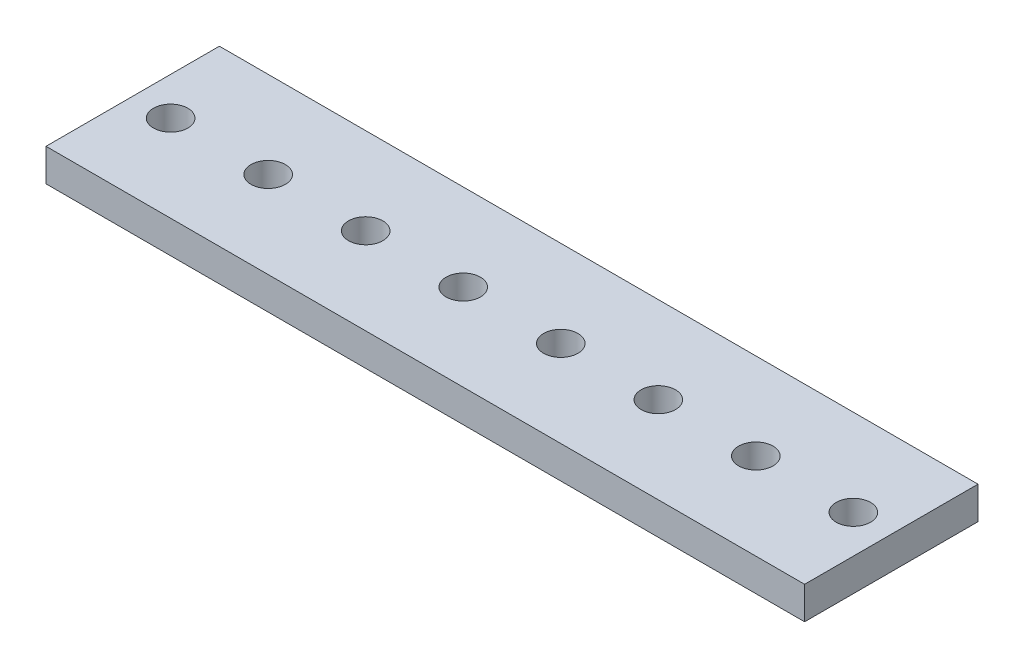
ISO-10303-21;
HEADER;
FILE_DESCRIPTION(('STEP AP214'),'2;1');
FILE_NAME('part.step','',(''),(''),'','','');
FILE_SCHEMA(('AUTOMOTIVE_DESIGN { 1 0 10303 214 1 1 1 1 }'));
ENDSEC;
DATA;
#1=APPLICATION_CONTEXT('core data for automotive mechanical design processes');
#2=APPLICATION_PROTOCOL_DEFINITION('international standard','automotive_design',2000,#1);
#3=PRODUCT_CONTEXT('',#1,'mechanical');
#4=PRODUCT('Part','Part','',(#3));
#5=PRODUCT_RELATED_PRODUCT_CATEGORY('part','',(#4));
#6=PRODUCT_DEFINITION_FORMATION('','',#4);
#7=PRODUCT_DEFINITION_CONTEXT('part definition',#1,'design');
#8=PRODUCT_DEFINITION('design','',#6,#7);
#9=PRODUCT_DEFINITION_SHAPE('','',#8);
#10=(LENGTH_UNIT() NAMED_UNIT(*) SI_UNIT(.MILLI.,.METRE.));
#11=(NAMED_UNIT(*) PLANE_ANGLE_UNIT() SI_UNIT($,.RADIAN.));
#12=(NAMED_UNIT(*) SI_UNIT($,.STERADIAN.) SOLID_ANGLE_UNIT());
#13=UNCERTAINTY_MEASURE_WITH_UNIT(LENGTH_MEASURE(1.E-05),#10,'distance_accuracy_value','');
#14=(GEOMETRIC_REPRESENTATION_CONTEXT(3) GLOBAL_UNCERTAINTY_ASSIGNED_CONTEXT((#13)) GLOBAL_UNIT_ASSIGNED_CONTEXT((#10,
#11,#12)) REPRESENTATION_CONTEXT('',''));
#15=CARTESIAN_POINT('',(0.,0.,0.));
#16=DIRECTION('',(0.,0.,1.));
#17=DIRECTION('',(1.,0.,0.));
#18=AXIS2_PLACEMENT_3D('',#15,#16,#17);
#19=CARTESIAN_POINT('',(-35.,3.,-7.99999999999999));
#20=DIRECTION('',(0.,-1.,0.));
#21=DIRECTION('',(0.,0.,-1.));
#22=AXIS2_PLACEMENT_3D('',#19,#20,#21);
#23=PLANE('',#22);
#24=CARTESIAN_POINT('',(-22.5,3.,1.25693328198353E-13));
#25=DIRECTION('',(0.,1.,0.));
#26=DIRECTION('',(0.,0.,1.));
#27=AXIS2_PLACEMENT_3D('',#24,#25,#26);
#28=CIRCLE('',#27,1.5875);
#29=CARTESIAN_POINT('',(-22.5,3.,1.58750000000012));
#30=VERTEX_POINT('',#29);
#31=EDGE_CURVE('E145',#30,#30,#28,.T.);
#32=ORIENTED_EDGE('',*,*,#31,.F.);
#33=EDGE_LOOP('',(#32));
#34=FACE_BOUND('',#33,.T.);
#35=CARTESIAN_POINT('',(31.5,3.,0.));
#36=DIRECTION('',(0.,1.,0.));
#37=DIRECTION('',(0.,0.,1.));
#38=AXIS2_PLACEMENT_3D('',#35,#36,#37);
#39=CIRCLE('',#38,1.5875);
#40=CARTESIAN_POINT('',(31.5,3.,1.5875));
#41=VERTEX_POINT('',#40);
#42=EDGE_CURVE('E133',#41,#41,#39,.T.);
#43=ORIENTED_EDGE('',*,*,#42,.F.);
#44=EDGE_LOOP('',(#43));
#45=FACE_BOUND('',#44,.T.);
#46=CARTESIAN_POINT('',(13.5,3.,0.));
#47=DIRECTION('',(0.,1.,0.));
#48=DIRECTION('',(0.,0.,1.));
#49=AXIS2_PLACEMENT_3D('',#46,#47,#48);
#50=CIRCLE('',#49,1.5875);
#51=CARTESIAN_POINT('',(13.5,3.,1.5875000000001));
#52=VERTEX_POINT('',#51);
#53=EDGE_CURVE('E121',#52,#52,#50,.T.);
#54=ORIENTED_EDGE('',*,*,#53,.F.);
#55=EDGE_LOOP('',(#54));
#56=FACE_BOUND('',#55,.T.);
#57=CARTESIAN_POINT('',(-4.5,3.,0.));
#58=DIRECTION('',(0.,1.,0.));
#59=DIRECTION('',(0.,0.,1.));
#60=AXIS2_PLACEMENT_3D('',#57,#58,#59);
#61=CIRCLE('',#60,1.5875);
#62=CARTESIAN_POINT('',(-4.5,3.,1.5875));
#63=VERTEX_POINT('',#62);
#64=EDGE_CURVE('E100',#63,#63,#61,.T.);
#65=ORIENTED_EDGE('',*,*,#64,.F.);
#66=EDGE_LOOP('',(#65));
#67=FACE_BOUND('',#66,.T.);
#68=DIRECTION('',(-1.,0.,0.));
#69=VECTOR('',#68,1.);
#70=CARTESIAN_POINT('',(35.,3.,-8.00000000000001));
#71=LINE('',#70,#69);
#72=CARTESIAN_POINT('',(35.,3.,-8.00000000000001));
#73=VERTEX_POINT('',#72);
#74=CARTESIAN_POINT('',(-35.,3.,-8.));
#75=VERTEX_POINT('',#74);
#76=EDGE_CURVE('E85',#73,#75,#71,.T.);
#77=ORIENTED_EDGE('',*,*,#76,.T.);
#78=DIRECTION('',(0.,0.,1.));
#79=VECTOR('',#78,1.);
#80=CARTESIAN_POINT('',(-35.,3.,8.00000000000001));
#81=LINE('',#80,#79);
#82=CARTESIAN_POINT('',(-35.,3.,8.00000000000001));
#83=VERTEX_POINT('',#82);
#84=EDGE_CURVE('E80',#75,#83,#81,.T.);
#85=ORIENTED_EDGE('',*,*,#84,.T.);
#86=DIRECTION('',(1.,0.,0.));
#87=VECTOR('',#86,1.);
#88=CARTESIAN_POINT('',(35.,3.,8.));
#89=LINE('',#88,#87);
#90=CARTESIAN_POINT('',(35.,3.,8.));
#91=VERTEX_POINT('',#90);
#92=EDGE_CURVE('E83',#83,#91,#89,.T.);
#93=ORIENTED_EDGE('',*,*,#92,.T.);
#94=DIRECTION('',(0.,0.,-1.));
#95=VECTOR('',#94,1.);
#96=CARTESIAN_POINT('',(35.,3.,8.));
#97=LINE('',#96,#95);
#98=EDGE_CURVE('E50',#91,#73,#97,.T.);
#99=ORIENTED_EDGE('',*,*,#98,.T.);
#100=EDGE_LOOP('',(#77,#85,#93,#99));
#101=FACE_BOUND('',#100,.T.);
#102=CARTESIAN_POINT('',(4.5,3.,0.));
#103=DIRECTION('',(0.,1.,0.));
#104=DIRECTION('',(0.,0.,1.));
#105=AXIS2_PLACEMENT_3D('',#102,#103,#104);
#106=CIRCLE('',#105,1.5875);
#107=CARTESIAN_POINT('',(4.5,3.,1.58750000000005));
#108=VERTEX_POINT('',#107);
#109=EDGE_CURVE('E115',#108,#108,#106,.T.);
#110=ORIENTED_EDGE('',*,*,#109,.F.);
#111=EDGE_LOOP('',(#110));
#112=FACE_BOUND('',#111,.T.);
#113=CARTESIAN_POINT('',(22.5,3.,1.43765208071578E-13));
#114=DIRECTION('',(0.,1.,0.));
#115=DIRECTION('',(0.,0.,1.));
#116=AXIS2_PLACEMENT_3D('',#113,#114,#115);
#117=CIRCLE('',#116,1.5875);
#118=CARTESIAN_POINT('',(22.5,3.,1.58750000000014));
#119=VERTEX_POINT('',#118);
#120=EDGE_CURVE('E127',#119,#119,#117,.T.);
#121=ORIENTED_EDGE('',*,*,#120,.F.);
#122=EDGE_LOOP('',(#121));
#123=FACE_BOUND('',#122,.T.);
#124=CARTESIAN_POINT('',(-13.5,3.,0.));
#125=DIRECTION('',(0.,1.,0.));
#126=DIRECTION('',(0.,0.,1.));
#127=AXIS2_PLACEMENT_3D('',#124,#125,#126);
#128=CIRCLE('',#127,1.5875);
#129=CARTESIAN_POINT('',(-13.5,3.,1.58750000000006));
#130=VERTEX_POINT('',#129);
#131=EDGE_CURVE('E139',#130,#130,#128,.T.);
#132=ORIENTED_EDGE('',*,*,#131,.F.);
#133=EDGE_LOOP('',(#132));
#134=FACE_BOUND('',#133,.T.);
#135=CARTESIAN_POINT('',(-31.5,3.,1.88539992297529E-13));
#136=DIRECTION('',(0.,1.,0.));
#137=DIRECTION('',(0.,0.,1.));
#138=AXIS2_PLACEMENT_3D('',#135,#136,#137);
#139=CIRCLE('',#138,1.5875);
#140=CARTESIAN_POINT('',(-31.5,3.,1.58750000000019));
#141=VERTEX_POINT('',#140);
#142=EDGE_CURVE('E151',#141,#141,#139,.T.);
#143=ORIENTED_EDGE('',*,*,#142,.F.);
#144=EDGE_LOOP('',(#143));
#145=FACE_BOUND('',#144,.T.);
#146=ADVANCED_FACE('F33',(#34,#45,#56,#67,#101,#112,#123,#134,#145),#23,.F.);
#147=CARTESIAN_POINT('',(-35.,0.,-7.99999999999999));
#148=DIRECTION('',(0.,-1.,0.));
#149=DIRECTION('',(0.,0.,-1.));
#150=AXIS2_PLACEMENT_3D('',#147,#148,#149);
#151=PLANE('',#150);
#152=CARTESIAN_POINT('',(-22.5,0.,1.25693328198353E-13));
#153=DIRECTION('',(0.,1.,0.));
#154=DIRECTION('',(0.,0.,1.));
#155=AXIS2_PLACEMENT_3D('',#152,#153,#154);
#156=CIRCLE('',#155,1.5875);
#157=CARTESIAN_POINT('',(-22.5,0.,1.58750000000012));
#158=VERTEX_POINT('',#157);
#159=EDGE_CURVE('E148',#158,#158,#156,.T.);
#160=ORIENTED_EDGE('',*,*,#159,.T.);
#161=EDGE_LOOP('',(#160));
#162=FACE_BOUND('',#161,.T.);
#163=CARTESIAN_POINT('',(31.5,0.,0.));
#164=DIRECTION('',(0.,1.,0.));
#165=DIRECTION('',(0.,0.,1.));
#166=AXIS2_PLACEMENT_3D('',#163,#164,#165);
#167=CIRCLE('',#166,1.5875);
#168=CARTESIAN_POINT('',(31.5,0.,1.5875));
#169=VERTEX_POINT('',#168);
#170=EDGE_CURVE('E136',#169,#169,#167,.T.);
#171=ORIENTED_EDGE('',*,*,#170,.T.);
#172=EDGE_LOOP('',(#171));
#173=FACE_BOUND('',#172,.T.);
#174=CARTESIAN_POINT('',(13.5,0.,0.));
#175=DIRECTION('',(0.,1.,0.));
#176=DIRECTION('',(0.,0.,1.));
#177=AXIS2_PLACEMENT_3D('',#174,#175,#176);
#178=CIRCLE('',#177,1.5875);
#179=CARTESIAN_POINT('',(13.5,0.,1.5875000000001));
#180=VERTEX_POINT('',#179);
#181=EDGE_CURVE('E124',#180,#180,#178,.T.);
#182=ORIENTED_EDGE('',*,*,#181,.T.);
#183=EDGE_LOOP('',(#182));
#184=FACE_BOUND('',#183,.T.);
#185=CARTESIAN_POINT('',(-4.5,0.,0.));
#186=DIRECTION('',(0.,1.,0.));
#187=DIRECTION('',(0.,0.,1.));
#188=AXIS2_PLACEMENT_3D('',#185,#186,#187);
#189=CIRCLE('',#188,1.5875);
#190=CARTESIAN_POINT('',(-4.5,0.,1.5875));
#191=VERTEX_POINT('',#190);
#192=EDGE_CURVE('E112',#191,#191,#189,.T.);
#193=ORIENTED_EDGE('',*,*,#192,.T.);
#194=EDGE_LOOP('',(#193));
#195=FACE_BOUND('',#194,.T.);
#196=DIRECTION('',(-1.,0.,0.));
#197=VECTOR('',#196,1.);
#198=CARTESIAN_POINT('',(35.,0.,-8.00000000000001));
#199=LINE('',#198,#197);
#200=CARTESIAN_POINT('',(35.,0.,-8.00000000000001));
#201=VERTEX_POINT('',#200);
#202=CARTESIAN_POINT('',(-35.,0.,-8.));
#203=VERTEX_POINT('',#202);
#204=EDGE_CURVE('E97',#201,#203,#199,.T.);
#205=ORIENTED_EDGE('',*,*,#204,.F.);
#206=DIRECTION('',(0.,0.,-1.));
#207=VECTOR('',#206,1.);
#208=CARTESIAN_POINT('',(35.,0.,8.));
#209=LINE('',#208,#207);
#210=CARTESIAN_POINT('',(35.,0.,8.));
#211=VERTEX_POINT('',#210);
#212=EDGE_CURVE('E73',#211,#201,#209,.T.);
#213=ORIENTED_EDGE('',*,*,#212,.F.);
#214=DIRECTION('',(1.,0.,0.));
#215=VECTOR('',#214,1.);
#216=CARTESIAN_POINT('',(35.,0.,8.));
#217=LINE('',#216,#215);
#218=CARTESIAN_POINT('',(-35.,0.,8.00000000000001));
#219=VERTEX_POINT('',#218);
#220=EDGE_CURVE('E67',#219,#211,#217,.T.);
#221=ORIENTED_EDGE('',*,*,#220,.F.);
#222=DIRECTION('',(0.,0.,1.));
#223=VECTOR('',#222,1.);
#224=CARTESIAN_POINT('',(-35.,0.,8.00000000000001));
#225=LINE('',#224,#223);
#226=EDGE_CURVE('E89',#203,#219,#225,.T.);
#227=ORIENTED_EDGE('',*,*,#226,.F.);
#228=EDGE_LOOP('',(#205,#213,#221,#227));
#229=FACE_BOUND('',#228,.T.);
#230=CARTESIAN_POINT('',(4.5,0.,0.));
#231=DIRECTION('',(0.,1.,0.));
#232=DIRECTION('',(0.,0.,1.));
#233=AXIS2_PLACEMENT_3D('',#230,#231,#232);
#234=CIRCLE('',#233,1.5875);
#235=CARTESIAN_POINT('',(4.5,0.,1.58750000000005));
#236=VERTEX_POINT('',#235);
#237=EDGE_CURVE('E118',#236,#236,#234,.T.);
#238=ORIENTED_EDGE('',*,*,#237,.T.);
#239=EDGE_LOOP('',(#238));
#240=FACE_BOUND('',#239,.T.);
#241=CARTESIAN_POINT('',(22.5,0.,1.43765208071578E-13));
#242=DIRECTION('',(0.,1.,0.));
#243=DIRECTION('',(0.,0.,1.));
#244=AXIS2_PLACEMENT_3D('',#241,#242,#243);
#245=CIRCLE('',#244,1.5875);
#246=CARTESIAN_POINT('',(22.5,0.,1.58750000000014));
#247=VERTEX_POINT('',#246);
#248=EDGE_CURVE('E130',#247,#247,#245,.T.);
#249=ORIENTED_EDGE('',*,*,#248,.T.);
#250=EDGE_LOOP('',(#249));
#251=FACE_BOUND('',#250,.T.);
#252=CARTESIAN_POINT('',(-13.5,0.,0.));
#253=DIRECTION('',(0.,1.,0.));
#254=DIRECTION('',(0.,0.,1.));
#255=AXIS2_PLACEMENT_3D('',#252,#253,#254);
#256=CIRCLE('',#255,1.5875);
#257=CARTESIAN_POINT('',(-13.5,0.,1.58750000000006));
#258=VERTEX_POINT('',#257);
#259=EDGE_CURVE('E142',#258,#258,#256,.T.);
#260=ORIENTED_EDGE('',*,*,#259,.T.);
#261=EDGE_LOOP('',(#260));
#262=FACE_BOUND('',#261,.T.);
#263=CARTESIAN_POINT('',(-31.5,0.,1.88539992297529E-13));
#264=DIRECTION('',(0.,1.,0.));
#265=DIRECTION('',(0.,0.,1.));
#266=AXIS2_PLACEMENT_3D('',#263,#264,#265);
#267=CIRCLE('',#266,1.5875);
#268=CARTESIAN_POINT('',(-31.5,0.,1.58750000000019));
#269=VERTEX_POINT('',#268);
#270=EDGE_CURVE('E154',#269,#269,#267,.T.);
#271=ORIENTED_EDGE('',*,*,#270,.T.);
#272=EDGE_LOOP('',(#271));
#273=FACE_BOUND('',#272,.T.);
#274=ADVANCED_FACE('F108',(#162,#173,#184,#195,#229,#240,#251,#262,#273),#151,.T.);
#275=CARTESIAN_POINT('',(35.,3.,-8.00000000000001));
#276=DIRECTION('',(0.,0.,1.));
#277=DIRECTION('',(1.,0.,0.));
#278=AXIS2_PLACEMENT_3D('',#275,#276,#277);
#279=PLANE('',#278);
#280=ORIENTED_EDGE('',*,*,#204,.T.);
#281=DIRECTION('',(0.,-1.,0.));
#282=VECTOR('',#281,1.);
#283=CARTESIAN_POINT('',(-35.,3.,-8.));
#284=LINE('',#283,#282);
#285=EDGE_CURVE('E11',#75,#203,#284,.T.);
#286=ORIENTED_EDGE('',*,*,#285,.F.);
#287=ORIENTED_EDGE('',*,*,#76,.F.);
#288=DIRECTION('',(0.,-1.,0.));
#289=VECTOR('',#288,1.);
#290=CARTESIAN_POINT('',(35.,3.,-8.00000000000001));
#291=LINE('',#290,#289);
#292=EDGE_CURVE('E93',#73,#201,#291,.T.);
#293=ORIENTED_EDGE('',*,*,#292,.T.);
#294=EDGE_LOOP('',(#280,#286,#287,#293));
#295=FACE_BOUND('',#294,.T.);
#296=ADVANCED_FACE('F35',(#295),#279,.F.);
#297=CARTESIAN_POINT('',(-35.,3.,8.00000000000001));
#298=DIRECTION('',(1.,0.,0.));
#299=DIRECTION('',(0.,0.,-1.));
#300=AXIS2_PLACEMENT_3D('',#297,#298,#299);
#301=PLANE('',#300);
#302=ORIENTED_EDGE('',*,*,#226,.T.);
#303=DIRECTION('',(0.,-1.,0.));
#304=VECTOR('',#303,1.);
#305=CARTESIAN_POINT('',(-35.,3.,8.00000000000001));
#306=LINE('',#305,#304);
#307=EDGE_CURVE('E42',#83,#219,#306,.T.);
#308=ORIENTED_EDGE('',*,*,#307,.F.);
#309=ORIENTED_EDGE('',*,*,#84,.F.);
#310=ORIENTED_EDGE('',*,*,#285,.T.);
#311=EDGE_LOOP('',(#302,#308,#309,#310));
#312=FACE_BOUND('',#311,.T.);
#313=ADVANCED_FACE('F88',(#312),#301,.F.);
#314=CARTESIAN_POINT('',(35.,3.,8.));
#315=DIRECTION('',(0.,0.,-1.));
#316=DIRECTION('',(-1.,0.,0.));
#317=AXIS2_PLACEMENT_3D('',#314,#315,#316);
#318=PLANE('',#317);
#319=ORIENTED_EDGE('',*,*,#220,.T.);
#320=DIRECTION('',(0.,-1.,0.));
#321=VECTOR('',#320,1.);
#322=CARTESIAN_POINT('',(35.,3.,8.));
#323=LINE('',#322,#321);
#324=EDGE_CURVE('E90',#91,#211,#323,.T.);
#325=ORIENTED_EDGE('',*,*,#324,.F.);
#326=ORIENTED_EDGE('',*,*,#92,.F.);
#327=ORIENTED_EDGE('',*,*,#307,.T.);
#328=EDGE_LOOP('',(#319,#325,#326,#327));
#329=FACE_BOUND('',#328,.T.);
#330=ADVANCED_FACE('F91',(#329),#318,.F.);
#331=CARTESIAN_POINT('',(35.,3.,8.));
#332=DIRECTION('',(-1.,0.,0.));
#333=DIRECTION('',(0.,0.,1.));
#334=AXIS2_PLACEMENT_3D('',#331,#332,#333);
#335=PLANE('',#334);
#336=ORIENTED_EDGE('',*,*,#212,.T.);
#337=ORIENTED_EDGE('',*,*,#292,.F.);
#338=ORIENTED_EDGE('',*,*,#98,.F.);
#339=ORIENTED_EDGE('',*,*,#324,.T.);
#340=EDGE_LOOP('',(#336,#337,#338,#339));
#341=FACE_BOUND('',#340,.T.);
#342=ADVANCED_FACE('F105',(#341),#335,.F.);
#343=CARTESIAN_POINT('',(-4.5,3.,0.));
#344=DIRECTION('',(0.,-1.,0.));
#345=DIRECTION('',(0.,0.,-1.));
#346=AXIS2_PLACEMENT_3D('',#343,#344,#345);
#347=CYLINDRICAL_SURFACE('',#346,1.5875);
#348=ORIENTED_EDGE('',*,*,#64,.T.);
#349=EDGE_LOOP('',(#348));
#350=FACE_BOUND('',#349,.T.);
#351=ORIENTED_EDGE('',*,*,#192,.F.);
#352=EDGE_LOOP('',(#351));
#353=FACE_BOUND('',#352,.T.);
#354=ADVANCED_FACE('F174',(#350,#353),#347,.F.);
#355=CARTESIAN_POINT('',(4.5,3.,0.));
#356=DIRECTION('',(0.,-1.,0.));
#357=DIRECTION('',(0.,0.,-1.));
#358=AXIS2_PLACEMENT_3D('',#355,#356,#357);
#359=CYLINDRICAL_SURFACE('',#358,1.5875);
#360=ORIENTED_EDGE('',*,*,#109,.T.);
#361=EDGE_LOOP('',(#360));
#362=FACE_BOUND('',#361,.T.);
#363=ORIENTED_EDGE('',*,*,#237,.F.);
#364=EDGE_LOOP('',(#363));
#365=FACE_BOUND('',#364,.T.);
#366=ADVANCED_FACE('F220',(#362,#365),#359,.F.);
#367=CARTESIAN_POINT('',(13.5,3.,0.));
#368=DIRECTION('',(0.,-1.,0.));
#369=DIRECTION('',(0.,0.,-1.));
#370=AXIS2_PLACEMENT_3D('',#367,#368,#369);
#371=CYLINDRICAL_SURFACE('',#370,1.5875);
#372=ORIENTED_EDGE('',*,*,#53,.T.);
#373=EDGE_LOOP('',(#372));
#374=FACE_BOUND('',#373,.T.);
#375=ORIENTED_EDGE('',*,*,#181,.F.);
#376=EDGE_LOOP('',(#375));
#377=FACE_BOUND('',#376,.T.);
#378=ADVANCED_FACE('F228',(#374,#377),#371,.F.);
#379=CARTESIAN_POINT('',(22.5,3.,1.43765208071578E-13));
#380=DIRECTION('',(0.,-1.,0.));
#381=DIRECTION('',(0.,0.,-1.));
#382=AXIS2_PLACEMENT_3D('',#379,#380,#381);
#383=CYLINDRICAL_SURFACE('',#382,1.5875);
#384=ORIENTED_EDGE('',*,*,#120,.T.);
#385=EDGE_LOOP('',(#384));
#386=FACE_BOUND('',#385,.T.);
#387=ORIENTED_EDGE('',*,*,#248,.F.);
#388=EDGE_LOOP('',(#387));
#389=FACE_BOUND('',#388,.T.);
#390=ADVANCED_FACE('F236',(#386,#389),#383,.F.);
#391=CARTESIAN_POINT('',(31.5,3.,0.));
#392=DIRECTION('',(0.,-1.,0.));
#393=DIRECTION('',(0.,0.,-1.));
#394=AXIS2_PLACEMENT_3D('',#391,#392,#393);
#395=CYLINDRICAL_SURFACE('',#394,1.5875);
#396=ORIENTED_EDGE('',*,*,#42,.T.);
#397=EDGE_LOOP('',(#396));
#398=FACE_BOUND('',#397,.T.);
#399=ORIENTED_EDGE('',*,*,#170,.F.);
#400=EDGE_LOOP('',(#399));
#401=FACE_BOUND('',#400,.T.);
#402=ADVANCED_FACE('F245',(#398,#401),#395,.F.);
#403=CARTESIAN_POINT('',(-13.5,3.,0.));
#404=DIRECTION('',(0.,-1.,0.));
#405=DIRECTION('',(0.,0.,-1.));
#406=AXIS2_PLACEMENT_3D('',#403,#404,#405);
#407=CYLINDRICAL_SURFACE('',#406,1.5875);
#408=ORIENTED_EDGE('',*,*,#131,.T.);
#409=EDGE_LOOP('',(#408));
#410=FACE_BOUND('',#409,.T.);
#411=ORIENTED_EDGE('',*,*,#259,.F.);
#412=EDGE_LOOP('',(#411));
#413=FACE_BOUND('',#412,.T.);
#414=ADVANCED_FACE('F254',(#410,#413),#407,.F.);
#415=CARTESIAN_POINT('',(-22.5,3.,1.25693328198353E-13));
#416=DIRECTION('',(0.,-1.,0.));
#417=DIRECTION('',(0.,0.,-1.));
#418=AXIS2_PLACEMENT_3D('',#415,#416,#417);
#419=CYLINDRICAL_SURFACE('',#418,1.5875);
#420=ORIENTED_EDGE('',*,*,#31,.T.);
#421=EDGE_LOOP('',(#420));
#422=FACE_BOUND('',#421,.T.);
#423=ORIENTED_EDGE('',*,*,#159,.F.);
#424=EDGE_LOOP('',(#423));
#425=FACE_BOUND('',#424,.T.);
#426=ADVANCED_FACE('F263',(#422,#425),#419,.F.);
#427=CARTESIAN_POINT('',(-31.5,3.,1.88539992297529E-13));
#428=DIRECTION('',(0.,-1.,0.));
#429=DIRECTION('',(0.,0.,-1.));
#430=AXIS2_PLACEMENT_3D('',#427,#428,#429);
#431=CYLINDRICAL_SURFACE('',#430,1.5875);
#432=ORIENTED_EDGE('',*,*,#142,.T.);
#433=EDGE_LOOP('',(#432));
#434=FACE_BOUND('',#433,.T.);
#435=ORIENTED_EDGE('',*,*,#270,.F.);
#436=EDGE_LOOP('',(#435));
#437=FACE_BOUND('',#436,.T.);
#438=ADVANCED_FACE('F160',(#434,#437),#431,.F.);
#439=CLOSED_SHELL('',(#146,#274,#296,#313,#330,#342,#354,#366,#378,#390,#402,#414,#426,#438));
#440=MANIFOLD_SOLID_BREP('B2',#439);
#441=ADVANCED_BREP_SHAPE_REPRESENTATION('',(#18,#440),#14);
#442=SHAPE_DEFINITION_REPRESENTATION(#9,#441);
ENDSEC;
END-ISO-10303-21;
